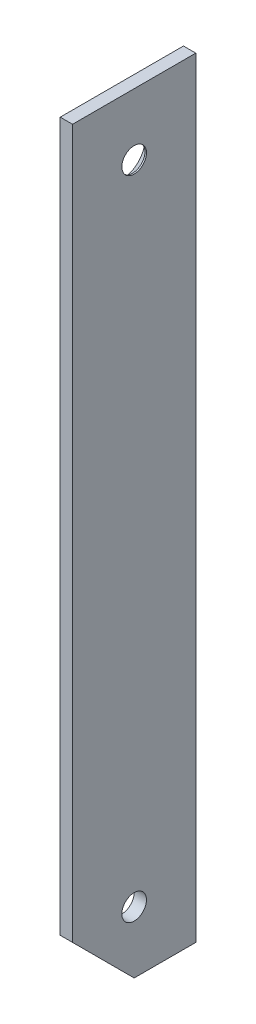
ISO-10303-21;
HEADER;
FILE_DESCRIPTION(('STEP AP214'),'2;1');
FILE_NAME('part.step','',(''),(''),'','','');
FILE_SCHEMA(('AUTOMOTIVE_DESIGN { 1 0 10303 214 1 1 1 1 }'));
ENDSEC;
DATA;
#1=APPLICATION_CONTEXT('core data for automotive mechanical design processes');
#2=APPLICATION_PROTOCOL_DEFINITION('international standard','automotive_design',2000,#1);
#3=PRODUCT_CONTEXT('',#1,'mechanical');
#4=PRODUCT('Part','Part','',(#3));
#5=PRODUCT_RELATED_PRODUCT_CATEGORY('part','',(#4));
#6=PRODUCT_DEFINITION_FORMATION('','',#4);
#7=PRODUCT_DEFINITION_CONTEXT('part definition',#1,'design');
#8=PRODUCT_DEFINITION('design','',#6,#7);
#9=PRODUCT_DEFINITION_SHAPE('','',#8);
#10=(LENGTH_UNIT() NAMED_UNIT(*) SI_UNIT(.MILLI.,.METRE.));
#11=(NAMED_UNIT(*) PLANE_ANGLE_UNIT() SI_UNIT($,.RADIAN.));
#12=(NAMED_UNIT(*) SI_UNIT($,.STERADIAN.) SOLID_ANGLE_UNIT());
#13=UNCERTAINTY_MEASURE_WITH_UNIT(LENGTH_MEASURE(1.E-05),#10,'distance_accuracy_value','');
#14=(GEOMETRIC_REPRESENTATION_CONTEXT(3) GLOBAL_UNCERTAINTY_ASSIGNED_CONTEXT((#13)) GLOBAL_UNIT_ASSIGNED_CONTEXT((#10,
#11,#12)) REPRESENTATION_CONTEXT('',''));
#15=CARTESIAN_POINT('',(0.,0.,0.));
#16=DIRECTION('',(0.,0.,1.));
#17=DIRECTION('',(1.,0.,0.));
#18=AXIS2_PLACEMENT_3D('',#15,#16,#17);
#19=CARTESIAN_POINT('',(4.,0.,0.));
#20=DIRECTION('',(1.,0.,0.));
#21=DIRECTION('',(0.,0.,-1.));
#22=AXIS2_PLACEMENT_3D('',#19,#20,#21);
#23=PLANE('',#22);
#24=CARTESIAN_POINT('',(4.,105.,0.));
#25=DIRECTION('',(1.,0.,0.));
#26=DIRECTION('',(0.,0.,-1.));
#27=AXIS2_PLACEMENT_3D('',#24,#25,#26);
#28=CIRCLE('',#27,4.00000000000001);
#29=CARTESIAN_POINT('',(4.,105.,-3.99999999999998));
#30=VERTEX_POINT('',#29);
#31=EDGE_CURVE('E137',#30,#30,#28,.T.);
#32=ORIENTED_EDGE('',*,*,#31,.F.);
#33=EDGE_LOOP('',(#32));
#34=FACE_BOUND('',#33,.T.);
#35=DIRECTION('',(0.,-1.,0.));
#36=VECTOR('',#35,1.);
#37=CARTESIAN_POINT('',(4.,125.,20.));
#38=LINE('',#37,#36);
#39=CARTESIAN_POINT('',(4.,125.,20.));
#40=VERTEX_POINT('',#39);
#41=CARTESIAN_POINT('',(4.,-105.,20.));
#42=VERTEX_POINT('',#41);
#43=EDGE_CURVE('E93',#40,#42,#38,.T.);
#44=ORIENTED_EDGE('',*,*,#43,.T.);
#45=DIRECTION('',(0.,0.707106781186548,0.707106781186547));
#46=VECTOR('',#45,1.);
#47=CARTESIAN_POINT('',(4.,-62.4999999999998,62.4999999999999));
#48=LINE('',#47,#46);
#49=CARTESIAN_POINT('',(4.,-125.,0.));
#50=VERTEX_POINT('',#49);
#51=EDGE_CURVE('E11',#42,#50,#48,.F.);
#52=ORIENTED_EDGE('',*,*,#51,.T.);
#53=DIRECTION('',(0.,0.,-1.));
#54=VECTOR('',#53,1.);
#55=CARTESIAN_POINT('',(4.,-125.,20.));
#56=LINE('',#55,#54);
#57=CARTESIAN_POINT('',(4.,-125.,-20.));
#58=VERTEX_POINT('',#57);
#59=EDGE_CURVE('E99',#50,#58,#56,.T.);
#60=ORIENTED_EDGE('',*,*,#59,.T.);
#61=DIRECTION('',(0.,1.,0.));
#62=VECTOR('',#61,1.);
#63=CARTESIAN_POINT('',(4.,125.,-20.));
#64=LINE('',#63,#62);
#65=CARTESIAN_POINT('',(4.,125.,-20.));
#66=VERTEX_POINT('',#65);
#67=EDGE_CURVE('E94',#58,#66,#64,.T.);
#68=ORIENTED_EDGE('',*,*,#67,.T.);
#69=DIRECTION('',(0.,0.,1.));
#70=VECTOR('',#69,1.);
#71=CARTESIAN_POINT('',(4.,125.,20.));
#72=LINE('',#71,#70);
#73=EDGE_CURVE('E84',#66,#40,#72,.T.);
#74=ORIENTED_EDGE('',*,*,#73,.T.);
#75=EDGE_LOOP('',(#44,#52,#60,#68,#74));
#76=FACE_BOUND('',#75,.T.);
#77=CARTESIAN_POINT('',(4.,-105.,0.));
#78=DIRECTION('',(1.,0.,0.));
#79=DIRECTION('',(0.,0.,-1.));
#80=AXIS2_PLACEMENT_3D('',#77,#78,#79);
#81=CIRCLE('',#80,4.00000000000001);
#82=CARTESIAN_POINT('',(4.,-105.,-4.00000000000004));
#83=VERTEX_POINT('',#82);
#84=EDGE_CURVE('E229',#83,#83,#81,.T.);
#85=ORIENTED_EDGE('',*,*,#84,.F.);
#86=EDGE_LOOP('',(#85));
#87=FACE_BOUND('',#86,.T.);
#88=ADVANCED_FACE('F37',(#34,#76,#87),#23,.T.);
#89=CARTESIAN_POINT('',(0.,0.,0.));
#90=DIRECTION('',(1.,0.,0.));
#91=DIRECTION('',(0.,0.,-1.));
#92=AXIS2_PLACEMENT_3D('',#89,#90,#91);
#93=PLANE('',#92);
#94=CARTESIAN_POINT('',(0.,105.,0.));
#95=DIRECTION('',(1.,0.,0.));
#96=DIRECTION('',(0.,0.,-1.));
#97=AXIS2_PLACEMENT_3D('',#94,#95,#96);
#98=CIRCLE('',#97,7.49999999999998);
#99=CARTESIAN_POINT('',(0.,105.,-7.49999999999995));
#100=VERTEX_POINT('',#99);
#101=EDGE_CURVE('E108',#100,#100,#98,.T.);
#102=ORIENTED_EDGE('',*,*,#101,.T.);
#103=EDGE_LOOP('',(#102));
#104=FACE_BOUND('',#103,.T.);
#105=DIRECTION('',(0.,0.,-1.));
#106=VECTOR('',#105,1.);
#107=CARTESIAN_POINT('',(0.,-125.,20.));
#108=LINE('',#107,#106);
#109=CARTESIAN_POINT('',(0.,-125.,0.));
#110=VERTEX_POINT('',#109);
#111=CARTESIAN_POINT('',(0.,-125.,-20.));
#112=VERTEX_POINT('',#111);
#113=EDGE_CURVE('E103',#110,#112,#108,.T.);
#114=ORIENTED_EDGE('',*,*,#113,.F.);
#115=DIRECTION('',(0.,-0.707106781186548,-0.707106781186547));
#116=VECTOR('',#115,1.);
#117=CARTESIAN_POINT('',(0.,-125.,0.));
#118=LINE('',#117,#116);
#119=CARTESIAN_POINT('',(0.,-105.,20.));
#120=VERTEX_POINT('',#119);
#121=EDGE_CURVE('E59',#110,#120,#118,.F.);
#122=ORIENTED_EDGE('',*,*,#121,.T.);
#123=DIRECTION('',(0.,-1.,0.));
#124=VECTOR('',#123,1.);
#125=CARTESIAN_POINT('',(0.,125.,20.));
#126=LINE('',#125,#124);
#127=CARTESIAN_POINT('',(0.,125.,20.));
#128=VERTEX_POINT('',#127);
#129=EDGE_CURVE('E129',#128,#120,#126,.T.);
#130=ORIENTED_EDGE('',*,*,#129,.F.);
#131=DIRECTION('',(0.,0.,1.));
#132=VECTOR('',#131,1.);
#133=CARTESIAN_POINT('',(0.,125.,20.));
#134=LINE('',#133,#132);
#135=CARTESIAN_POINT('',(0.,125.,-20.));
#136=VERTEX_POINT('',#135);
#137=EDGE_CURVE('E131',#136,#128,#134,.T.);
#138=ORIENTED_EDGE('',*,*,#137,.F.);
#139=DIRECTION('',(0.,1.,0.));
#140=VECTOR('',#139,1.);
#141=CARTESIAN_POINT('',(0.,125.,-20.));
#142=LINE('',#141,#140);
#143=EDGE_CURVE('E107',#112,#136,#142,.T.);
#144=ORIENTED_EDGE('',*,*,#143,.F.);
#145=EDGE_LOOP('',(#114,#122,#130,#138,#144));
#146=FACE_BOUND('',#145,.T.);
#147=CARTESIAN_POINT('',(0.,-105.,0.));
#148=DIRECTION('',(1.,0.,0.));
#149=DIRECTION('',(0.,0.,-1.));
#150=AXIS2_PLACEMENT_3D('',#147,#148,#149);
#151=CIRCLE('',#150,4.00000000000001);
#152=CARTESIAN_POINT('',(0.,-105.,-4.00000000000004));
#153=VERTEX_POINT('',#152);
#154=EDGE_CURVE('E232',#153,#153,#151,.T.);
#155=ORIENTED_EDGE('',*,*,#154,.T.);
#156=EDGE_LOOP('',(#155));
#157=FACE_BOUND('',#156,.T.);
#158=ADVANCED_FACE('F127',(#104,#146,#157),#93,.F.);
#159=CARTESIAN_POINT('',(4.,125.,-20.));
#160=DIRECTION('',(0.,0.,1.));
#161=DIRECTION('',(0.,-1.,0.));
#162=AXIS2_PLACEMENT_3D('',#159,#160,#161);
#163=PLANE('',#162);
#164=ORIENTED_EDGE('',*,*,#143,.T.);
#165=DIRECTION('',(-1.,0.,0.));
#166=VECTOR('',#165,1.);
#167=CARTESIAN_POINT('',(4.,125.,-20.));
#168=LINE('',#167,#166);
#169=EDGE_CURVE('E88',#66,#136,#168,.T.);
#170=ORIENTED_EDGE('',*,*,#169,.F.);
#171=ORIENTED_EDGE('',*,*,#67,.F.);
#172=DIRECTION('',(-1.,0.,0.));
#173=VECTOR('',#172,1.);
#174=CARTESIAN_POINT('',(4.,-125.,-20.));
#175=LINE('',#174,#173);
#176=EDGE_CURVE('E113',#58,#112,#175,.T.);
#177=ORIENTED_EDGE('',*,*,#176,.T.);
#178=EDGE_LOOP('',(#164,#170,#171,#177));
#179=FACE_BOUND('',#178,.T.);
#180=ADVANCED_FACE('F105',(#179),#163,.F.);
#181=CARTESIAN_POINT('',(4.,125.,20.));
#182=DIRECTION('',(0.,-1.,0.));
#183=DIRECTION('',(0.,0.,-1.));
#184=AXIS2_PLACEMENT_3D('',#181,#182,#183);
#185=PLANE('',#184);
#186=ORIENTED_EDGE('',*,*,#137,.T.);
#187=DIRECTION('',(-1.,0.,0.));
#188=VECTOR('',#187,1.);
#189=CARTESIAN_POINT('',(4.,125.,20.));
#190=LINE('',#189,#188);
#191=EDGE_CURVE('E91',#40,#128,#190,.T.);
#192=ORIENTED_EDGE('',*,*,#191,.F.);
#193=ORIENTED_EDGE('',*,*,#73,.F.);
#194=ORIENTED_EDGE('',*,*,#169,.T.);
#195=EDGE_LOOP('',(#186,#192,#193,#194));
#196=FACE_BOUND('',#195,.T.);
#197=ADVANCED_FACE('F86',(#196),#185,.F.);
#198=CARTESIAN_POINT('',(4.,125.,20.));
#199=DIRECTION('',(0.,0.,-1.));
#200=DIRECTION('',(0.,1.,0.));
#201=AXIS2_PLACEMENT_3D('',#198,#199,#200);
#202=PLANE('',#201);
#203=ORIENTED_EDGE('',*,*,#129,.T.);
#204=DIRECTION('',(1.,0.,0.));
#205=VECTOR('',#204,1.);
#206=CARTESIAN_POINT('',(4.,-105.,20.));
#207=LINE('',#206,#205);
#208=EDGE_CURVE('E45',#120,#42,#207,.T.);
#209=ORIENTED_EDGE('',*,*,#208,.T.);
#210=ORIENTED_EDGE('',*,*,#43,.F.);
#211=ORIENTED_EDGE('',*,*,#191,.T.);
#212=EDGE_LOOP('',(#203,#209,#210,#211));
#213=FACE_BOUND('',#212,.T.);
#214=ADVANCED_FACE('F138',(#213),#202,.F.);
#215=CARTESIAN_POINT('',(4.,-125.,20.));
#216=DIRECTION('',(0.,1.,0.));
#217=DIRECTION('',(0.,0.,1.));
#218=AXIS2_PLACEMENT_3D('',#215,#216,#217);
#219=PLANE('',#218);
#220=ORIENTED_EDGE('',*,*,#59,.F.);
#221=DIRECTION('',(-1.,0.,0.));
#222=VECTOR('',#221,1.);
#223=CARTESIAN_POINT('',(4.,-125.,0.));
#224=LINE('',#223,#222);
#225=EDGE_CURVE('E119',#50,#110,#224,.T.);
#226=ORIENTED_EDGE('',*,*,#225,.T.);
#227=ORIENTED_EDGE('',*,*,#113,.T.);
#228=ORIENTED_EDGE('',*,*,#176,.F.);
#229=EDGE_LOOP('',(#220,#226,#227,#228));
#230=FACE_BOUND('',#229,.T.);
#231=ADVANCED_FACE('F124',(#230),#219,.F.);
#232=CARTESIAN_POINT('',(4.,105.,0.));
#233=DIRECTION('',(-1.,0.,0.));
#234=DIRECTION('',(0.,0.,1.));
#235=AXIS2_PLACEMENT_3D('',#232,#233,#234);
#236=CYLINDRICAL_SURFACE('',#235,4.00000000000001);
#237=CARTESIAN_POINT('',(3.49999999999999,105.,0.));
#238=DIRECTION('',(1.,0.,0.));
#239=DIRECTION('',(0.,0.,-1.));
#240=AXIS2_PLACEMENT_3D('',#237,#238,#239);
#241=CIRCLE('',#240,4.00000000000001);
#242=CARTESIAN_POINT('',(3.49999999999999,105.,-3.99999999999998));
#243=VERTEX_POINT('',#242);
#244=EDGE_CURVE('E111',#243,#243,#241,.F.);
#245=ORIENTED_EDGE('',*,*,#244,.T.);
#246=EDGE_LOOP('',(#245));
#247=FACE_BOUND('',#246,.T.);
#248=ORIENTED_EDGE('',*,*,#31,.T.);
#249=EDGE_LOOP('',(#248));
#250=FACE_BOUND('',#249,.T.);
#251=ADVANCED_FACE('F156',(#247,#250),#236,.F.);
#252=CARTESIAN_POINT('',(4.,-105.,0.));
#253=DIRECTION('',(-1.,0.,0.));
#254=DIRECTION('',(0.,0.,1.));
#255=AXIS2_PLACEMENT_3D('',#252,#253,#254);
#256=CYLINDRICAL_SURFACE('',#255,4.00000000000001);
#257=ORIENTED_EDGE('',*,*,#84,.T.);
#258=EDGE_LOOP('',(#257));
#259=FACE_BOUND('',#258,.T.);
#260=ORIENTED_EDGE('',*,*,#154,.F.);
#261=EDGE_LOOP('',(#260));
#262=FACE_BOUND('',#261,.T.);
#263=ADVANCED_FACE('F144',(#259,#262),#256,.F.);
#264=CARTESIAN_POINT('',(0.,105.,0.));
#265=DIRECTION('',(-1.,0.,0.));
#266=DIRECTION('',(0.,0.,1.));
#267=AXIS2_PLACEMENT_3D('',#264,#265,#266);
#268=CONICAL_SURFACE('',#267,7.49999999999998,0.785398163397446);
#269=ORIENTED_EDGE('',*,*,#244,.F.);
#270=EDGE_LOOP('',(#269));
#271=FACE_BOUND('',#270,.T.);
#272=ORIENTED_EDGE('',*,*,#101,.F.);
#273=EDGE_LOOP('',(#272));
#274=FACE_BOUND('',#273,.T.);
#275=ADVANCED_FACE('F140',(#271,#274),#268,.F.);
#276=CARTESIAN_POINT('',(4.,-125.,0.));
#277=DIRECTION('',(0.,0.707106781186547,-0.707106781186548));
#278=DIRECTION('',(-1.,0.,0.));
#279=AXIS2_PLACEMENT_3D('',#276,#277,#278);
#280=PLANE('',#279);
#281=ORIENTED_EDGE('',*,*,#51,.F.);
#282=ORIENTED_EDGE('',*,*,#208,.F.);
#283=ORIENTED_EDGE('',*,*,#121,.F.);
#284=ORIENTED_EDGE('',*,*,#225,.F.);
#285=EDGE_LOOP('',(#281,#282,#283,#284));
#286=FACE_BOUND('',#285,.T.);
#287=ADVANCED_FACE('F39',(#286),#280,.F.);
#288=CLOSED_SHELL('',(#88,#158,#180,#197,#214,#231,#251,#263,#275,#287));
#289=MANIFOLD_SOLID_BREP('B2',#288);
#290=ADVANCED_BREP_SHAPE_REPRESENTATION('',(#18,#289),#14);
#291=SHAPE_DEFINITION_REPRESENTATION(#9,#290);
ENDSEC;
END-ISO-10303-21;
